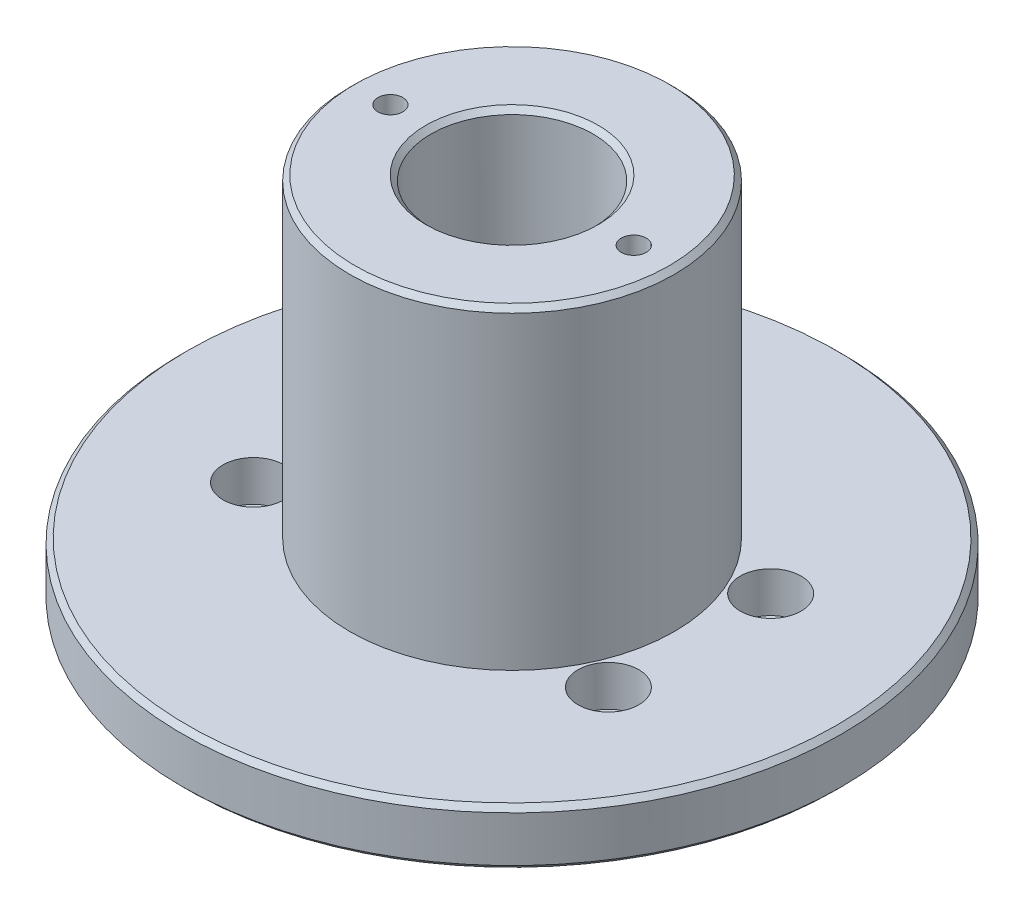
ISO-10303-21;
HEADER;
FILE_DESCRIPTION(('STEP AP214'),'2;1');
FILE_NAME('part.step','',(''),(''),'','','');
FILE_SCHEMA(('AUTOMOTIVE_DESIGN { 1 0 10303 214 1 1 1 1 }'));
ENDSEC;
DATA;
#1=APPLICATION_CONTEXT('core data for automotive mechanical design processes');
#2=APPLICATION_PROTOCOL_DEFINITION('international standard','automotive_design',2000,#1);
#3=PRODUCT_CONTEXT('',#1,'mechanical');
#4=PRODUCT('Part','Part','',(#3));
#5=PRODUCT_RELATED_PRODUCT_CATEGORY('part','',(#4));
#6=PRODUCT_DEFINITION_FORMATION('','',#4);
#7=PRODUCT_DEFINITION_CONTEXT('part definition',#1,'design');
#8=PRODUCT_DEFINITION('design','',#6,#7);
#9=PRODUCT_DEFINITION_SHAPE('','',#8);
#10=(LENGTH_UNIT() NAMED_UNIT(*) SI_UNIT(.MILLI.,.METRE.));
#11=(NAMED_UNIT(*) PLANE_ANGLE_UNIT() SI_UNIT($,.RADIAN.));
#12=(NAMED_UNIT(*) SI_UNIT($,.STERADIAN.) SOLID_ANGLE_UNIT());
#13=UNCERTAINTY_MEASURE_WITH_UNIT(LENGTH_MEASURE(1.E-05),#10,'distance_accuracy_value','');
#14=(GEOMETRIC_REPRESENTATION_CONTEXT(3) GLOBAL_UNCERTAINTY_ASSIGNED_CONTEXT((#13)) GLOBAL_UNIT_ASSIGNED_CONTEXT((#10,
#11,#12)) REPRESENTATION_CONTEXT('',''));
#15=CARTESIAN_POINT('',(0.,0.,0.));
#16=DIRECTION('',(0.,0.,1.));
#17=DIRECTION('',(1.,0.,0.));
#18=AXIS2_PLACEMENT_3D('',#15,#16,#17);
#19=CARTESIAN_POINT('',(-44.3647992402862,5.4957909129693,25.1937929558718));
#20=DIRECTION('',(0.,-1.,0.));
#21=DIRECTION('',(1.,0.,0.));
#22=AXIS2_PLACEMENT_3D('',#19,#20,#21);
#23=PLANE('',#22);
#24=CARTESIAN_POINT('',(-44.3647992402862,5.4957909129693,25.1937929558718));
#25=DIRECTION('',(0.,1.,0.));
#26=DIRECTION('',(-1.,0.,0.));
#27=AXIS2_PLACEMENT_3D('',#24,#25,#26);
#28=CIRCLE('',#27,8.);
#29=CARTESIAN_POINT('',(-52.3647992402862,5.4957909129693,25.1937929558718));
#30=VERTEX_POINT('',#29);
#31=EDGE_CURVE('E20',#30,#30,#28,.T.);
#32=ORIENTED_EDGE('',*,*,#31,.T.);
#33=EDGE_LOOP('',(#32));
#34=FACE_BOUND('',#33,.T.);
#35=ADVANCED_FACE('F17',(#34),#23,.F.);
#36=CARTESIAN_POINT('',(-32.3647992402862,26.495790912918,25.1937929558718));
#37=DIRECTION('',(0.,1.,0.));
#38=DIRECTION('',(-1.,0.,0.));
#39=AXIS2_PLACEMENT_3D('',#36,#37,#38);
#40=CONICAL_SURFACE('',#39,1.22949999989212,1.02974425857207);
#41=CARTESIAN_POINT('',(-32.364799240213,25.7570327818826,25.1937929558718));
#42=VERTEX_POINT('',#41);
#43=VERTEX_LOOP('',#42);
#44=FACE_BOUND('',#43,.T.);
#45=CARTESIAN_POINT('',(-32.3647992402862,26.4957909129693,25.1937929558718));
#46=DIRECTION('',(0.,1.,0.));
#47=DIRECTION('',(-1.,0.,0.));
#48=AXIS2_PLACEMENT_3D('',#45,#46,#47);
#49=CIRCLE('',#48,1.2295);
#50=CARTESIAN_POINT('',(-33.5942992402862,26.4957909129693,25.1937929558718));
#51=VERTEX_POINT('',#50);
#52=EDGE_CURVE('E45',#51,#51,#49,.T.);
#53=ORIENTED_EDGE('',*,*,#52,.T.);
#54=EDGE_LOOP('',(#53));
#55=FACE_BOUND('',#54,.T.);
#56=ADVANCED_FACE('F39',(#44,#55),#40,.F.);
#57=CARTESIAN_POINT('',(-56.3647992402862,26.495790912918,25.1937929558718));
#58=DIRECTION('',(0.,1.,0.));
#59=DIRECTION('',(0.,0.,1.));
#60=AXIS2_PLACEMENT_3D('',#57,#58,#59);
#61=CONICAL_SURFACE('',#60,1.22949999989302,1.02974425851834);
#62=CARTESIAN_POINT('',(-56.364799240157,25.7570327818257,25.1937929558718));
#63=VERTEX_POINT('',#62);
#64=VERTEX_LOOP('',#63);
#65=FACE_BOUND('',#64,.T.);
#66=CARTESIAN_POINT('',(-56.3647992402862,26.4957909129693,25.1937929558718));
#67=DIRECTION('',(0.,1.,0.));
#68=DIRECTION('',(-1.,0.,0.));
#69=AXIS2_PLACEMENT_3D('',#66,#67,#68);
#70=CIRCLE('',#69,1.2295);
#71=CARTESIAN_POINT('',(-57.5942992402862,26.4957909129693,25.1937929558718));
#72=VERTEX_POINT('',#71);
#73=EDGE_CURVE('E47',#72,#72,#70,.T.);
#74=ORIENTED_EDGE('',*,*,#73,.T.);
#75=EDGE_LOOP('',(#74));
#76=FACE_BOUND('',#75,.T.);
#77=ADVANCED_FACE('F42',(#65,#76),#61,.F.);
#78=CARTESIAN_POINT('',(-44.3647992402862,5.4957909129693,25.1937929558718));
#79=DIRECTION('',(0.,1.,0.));
#80=DIRECTION('',(-1.,0.,0.));
#81=AXIS2_PLACEMENT_3D('',#78,#79,#80);
#82=CYLINDRICAL_SURFACE('',#81,8.);
#83=CARTESIAN_POINT('',(-44.3647992402862,35.9957909129699,25.1937929558718));
#84=DIRECTION('',(0.,1.,0.));
#85=DIRECTION('',(1.,0.,0.));
#86=AXIS2_PLACEMENT_3D('',#83,#84,#85);
#87=CIRCLE('',#86,7.99999999999936);
#88=CARTESIAN_POINT('',(-36.3647992402868,35.9957909129699,25.1937929558718));
#89=VERTEX_POINT('',#88);
#90=EDGE_CURVE('E50',#89,#89,#87,.T.);
#91=ORIENTED_EDGE('',*,*,#90,.T.);
#92=EDGE_LOOP('',(#91));
#93=FACE_BOUND('',#92,.T.);
#94=ORIENTED_EDGE('',*,*,#31,.F.);
#95=EDGE_LOOP('',(#94));
#96=FACE_BOUND('',#95,.T.);
#97=ADVANCED_FACE('F250',(#93,#96),#82,.F.);
#98=CARTESIAN_POINT('',(-32.3647992402862,31.4957909129693,25.1937929558718));
#99=DIRECTION('',(0.,1.,0.));
#100=DIRECTION('',(-1.,0.,0.));
#101=AXIS2_PLACEMENT_3D('',#98,#99,#100);
#102=CYLINDRICAL_SURFACE('',#101,1.2295);
#103=ORIENTED_EDGE('',*,*,#52,.F.);
#104=EDGE_LOOP('',(#103));
#105=FACE_BOUND('',#104,.T.);
#106=CARTESIAN_POINT('',(-32.3647992402862,36.4957909129693,25.1937929558718));
#107=DIRECTION('',(0.,1.,0.));
#108=DIRECTION('',(-1.,0.,0.));
#109=AXIS2_PLACEMENT_3D('',#106,#107,#108);
#110=CIRCLE('',#109,1.2295);
#111=CARTESIAN_POINT('',(-33.5942992402862,36.4957909129693,25.1937929558718));
#112=VERTEX_POINT('',#111);
#113=EDGE_CURVE('E141',#112,#112,#110,.T.);
#114=ORIENTED_EDGE('',*,*,#113,.T.);
#115=EDGE_LOOP('',(#114));
#116=FACE_BOUND('',#115,.T.);
#117=ADVANCED_FACE('F246',(#105,#116),#102,.F.);
#118=CARTESIAN_POINT('',(-56.3647992402862,31.4957909129693,25.1937929558718));
#119=DIRECTION('',(0.,1.,0.));
#120=DIRECTION('',(-1.,0.,0.));
#121=AXIS2_PLACEMENT_3D('',#118,#119,#120);
#122=CYLINDRICAL_SURFACE('',#121,1.2295);
#123=ORIENTED_EDGE('',*,*,#73,.F.);
#124=EDGE_LOOP('',(#123));
#125=FACE_BOUND('',#124,.T.);
#126=CARTESIAN_POINT('',(-56.3647992402862,36.4957909129693,25.1937929558718));
#127=DIRECTION('',(0.,1.,0.));
#128=DIRECTION('',(-1.,0.,0.));
#129=AXIS2_PLACEMENT_3D('',#126,#127,#128);
#130=CIRCLE('',#129,1.2295);
#131=CARTESIAN_POINT('',(-57.5942992402862,36.4957909129693,25.1937929558718));
#132=VERTEX_POINT('',#131);
#133=EDGE_CURVE('E139',#132,#132,#130,.T.);
#134=ORIENTED_EDGE('',*,*,#133,.T.);
#135=EDGE_LOOP('',(#134));
#136=FACE_BOUND('',#135,.T.);
#137=ADVANCED_FACE('F242',(#125,#136),#122,.F.);
#138=CARTESIAN_POINT('',(-44.3647992402862,36.4957909129687,25.1937929558718));
#139=DIRECTION('',(0.,1.,0.));
#140=DIRECTION('',(0.,0.,1.));
#141=AXIS2_PLACEMENT_3D('',#138,#139,#140);
#142=CONICAL_SURFACE('',#141,8.50000000000064,0.785398163400002);
#143=CARTESIAN_POINT('',(-44.3647992402862,36.4957909129687,25.1937929558718));
#144=DIRECTION('',(0.,1.,0.));
#145=DIRECTION('',(0.,0.,1.));
#146=AXIS2_PLACEMENT_3D('',#143,#144,#145);
#147=CIRCLE('',#146,8.50000000000064);
#148=CARTESIAN_POINT('',(-44.3647992402862,36.4957909129687,33.6937929558724));
#149=VERTEX_POINT('',#148);
#150=EDGE_CURVE('E136',#149,#149,#147,.T.);
#151=ORIENTED_EDGE('',*,*,#150,.T.);
#152=EDGE_LOOP('',(#151));
#153=FACE_BOUND('',#152,.T.);
#154=ORIENTED_EDGE('',*,*,#90,.F.);
#155=EDGE_LOOP('',(#154));
#156=FACE_BOUND('',#155,.T.);
#157=ADVANCED_FACE('F238',(#153,#156),#142,.F.);
#158=CARTESIAN_POINT('',(-44.3647992402862,36.4957909129693,25.1937929558718));
#159=DIRECTION('',(0.,-1.,0.));
#160=DIRECTION('',(1.,0.,0.));
#161=AXIS2_PLACEMENT_3D('',#158,#159,#160);
#162=PLANE('',#161);
#163=ORIENTED_EDGE('',*,*,#150,.F.);
#164=EDGE_LOOP('',(#163));
#165=FACE_BOUND('',#164,.T.);
#166=ORIENTED_EDGE('',*,*,#133,.F.);
#167=EDGE_LOOP('',(#166));
#168=FACE_BOUND('',#167,.T.);
#169=ORIENTED_EDGE('',*,*,#113,.F.);
#170=EDGE_LOOP('',(#169));
#171=FACE_BOUND('',#170,.T.);
#172=CARTESIAN_POINT('',(-44.3647992402862,36.4957909129687,25.1937929558718));
#173=DIRECTION('',(0.,-1.,0.));
#174=DIRECTION('',(1.,0.,0.));
#175=AXIS2_PLACEMENT_3D('',#172,#173,#174);
#176=CIRCLE('',#175,15.4999999999994);
#177=CARTESIAN_POINT('',(-28.8647992402869,36.4957909129687,25.1937929558718));
#178=VERTEX_POINT('',#177);
#179=EDGE_CURVE('E133',#178,#178,#176,.T.);
#180=ORIENTED_EDGE('',*,*,#179,.F.);
#181=EDGE_LOOP('',(#180));
#182=FACE_BOUND('',#181,.T.);
#183=ADVANCED_FACE('F234',(#165,#168,#171,#182),#162,.F.);
#184=CARTESIAN_POINT('',(-44.3647992402862,35.9957909129699,25.1937929558718));
#185=DIRECTION('',(0.,-1.,0.));
#186=DIRECTION('',(1.,0.,0.));
#187=AXIS2_PLACEMENT_3D('',#184,#185,#186);
#188=CONICAL_SURFACE('',#187,16.0000000000006,0.785398163400002);
#189=ORIENTED_EDGE('',*,*,#179,.T.);
#190=EDGE_LOOP('',(#189));
#191=FACE_BOUND('',#190,.T.);
#192=CARTESIAN_POINT('',(-44.3647992402862,35.9957909129693,25.1937929558718));
#193=DIRECTION('',(0.,1.,0.));
#194=DIRECTION('',(-1.,0.,0.));
#195=AXIS2_PLACEMENT_3D('',#192,#193,#194);
#196=CIRCLE('',#195,16.);
#197=CARTESIAN_POINT('',(-60.3647992402862,35.9957909129693,25.1937929558718));
#198=VERTEX_POINT('',#197);
#199=EDGE_CURVE('E132',#198,#198,#196,.F.);
#200=ORIENTED_EDGE('',*,*,#199,.F.);
#201=EDGE_LOOP('',(#200));
#202=FACE_BOUND('',#201,.T.);
#203=ADVANCED_FACE('F230',(#191,#202),#188,.T.);
#204=CARTESIAN_POINT('',(-44.3647992402862,5.4957909129693,25.1937929558718));
#205=DIRECTION('',(0.,1.,0.));
#206=DIRECTION('',(-1.,0.,0.));
#207=AXIS2_PLACEMENT_3D('',#204,#205,#206);
#208=CYLINDRICAL_SURFACE('',#207,16.);
#209=ORIENTED_EDGE('',*,*,#199,.T.);
#210=EDGE_LOOP('',(#209));
#211=FACE_BOUND('',#210,.T.);
#212=CARTESIAN_POINT('',(-44.3647992402862,5.4957909129693,25.1937929558718));
#213=DIRECTION('',(0.,1.,0.));
#214=DIRECTION('',(-1.,0.,0.));
#215=AXIS2_PLACEMENT_3D('',#212,#213,#214);
#216=CIRCLE('',#215,16.);
#217=CARTESIAN_POINT('',(-60.3647992402862,5.4957909129693,25.1937929558718));
#218=VERTEX_POINT('',#217);
#219=EDGE_CURVE('E129',#218,#218,#216,.T.);
#220=ORIENTED_EDGE('',*,*,#219,.T.);
#221=EDGE_LOOP('',(#220));
#222=FACE_BOUND('',#221,.T.);
#223=ADVANCED_FACE('F223',(#211,#222),#208,.T.);
#224=CARTESIAN_POINT('',(-44.3647992402862,5.4957909129693,25.1937929558718));
#225=DIRECTION('',(0.,-1.,0.));
#226=DIRECTION('',(1.,0.,0.));
#227=AXIS2_PLACEMENT_3D('',#224,#225,#226);
#228=PLANE('',#227);
#229=ORIENTED_EDGE('',*,*,#219,.F.);
#230=EDGE_LOOP('',(#229));
#231=FACE_BOUND('',#230,.T.);
#232=CARTESIAN_POINT('',(-26.8647992402862,5.4957909129693,33.1937929558718));
#233=DIRECTION('',(0.,1.,0.));
#234=DIRECTION('',(-1.,0.,0.));
#235=AXIS2_PLACEMENT_3D('',#232,#233,#234);
#236=CIRCLE('',#235,3.);
#237=CARTESIAN_POINT('',(-29.8647992402862,5.4957909129693,33.1937929558718));
#238=VERTEX_POINT('',#237);
#239=EDGE_CURVE('E123',#238,#238,#236,.F.);
#240=ORIENTED_EDGE('',*,*,#239,.T.);
#241=EDGE_LOOP('',(#240));
#242=FACE_BOUND('',#241,.T.);
#243=CARTESIAN_POINT('',(-61.8647992402862,5.4957909129693,33.1937929558718));
#244=DIRECTION('',(0.,1.,0.));
#245=DIRECTION('',(-1.,0.,0.));
#246=AXIS2_PLACEMENT_3D('',#243,#244,#245);
#247=CIRCLE('',#246,3.);
#248=CARTESIAN_POINT('',(-64.8647992402862,5.4957909129693,33.1937929558718));
#249=VERTEX_POINT('',#248);
#250=EDGE_CURVE('E120',#249,#249,#247,.F.);
#251=ORIENTED_EDGE('',*,*,#250,.T.);
#252=EDGE_LOOP('',(#251));
#253=FACE_BOUND('',#252,.T.);
#254=CARTESIAN_POINT('',(-26.8647992402862,5.4957909129693,17.1937929558718));
#255=DIRECTION('',(0.,1.,0.));
#256=DIRECTION('',(-1.,0.,0.));
#257=AXIS2_PLACEMENT_3D('',#254,#255,#256);
#258=CIRCLE('',#257,3.);
#259=CARTESIAN_POINT('',(-29.8647992402862,5.4957909129693,17.1937929558718));
#260=VERTEX_POINT('',#259);
#261=EDGE_CURVE('E117',#260,#260,#258,.F.);
#262=ORIENTED_EDGE('',*,*,#261,.T.);
#263=EDGE_LOOP('',(#262));
#264=FACE_BOUND('',#263,.T.);
#265=CARTESIAN_POINT('',(-61.8647992402862,5.4957909129693,17.1937929558718));
#266=DIRECTION('',(0.,1.,0.));
#267=DIRECTION('',(-1.,0.,0.));
#268=AXIS2_PLACEMENT_3D('',#265,#266,#267);
#269=CIRCLE('',#268,3.);
#270=CARTESIAN_POINT('',(-64.8647992402862,5.4957909129693,17.1937929558718));
#271=VERTEX_POINT('',#270);
#272=EDGE_CURVE('E114',#271,#271,#269,.F.);
#273=ORIENTED_EDGE('',*,*,#272,.T.);
#274=EDGE_LOOP('',(#273));
#275=FACE_BOUND('',#274,.T.);
#276=CARTESIAN_POINT('',(-44.3647992402862,5.49579091296866,25.1937929558718));
#277=DIRECTION('',(0.,-1.,0.));
#278=DIRECTION('',(1.,0.,0.));
#279=AXIS2_PLACEMENT_3D('',#276,#277,#278);
#280=CIRCLE('',#279,31.9999999999994);
#281=CARTESIAN_POINT('',(-12.3647992402868,5.49579091296866,25.1937929558718));
#282=VERTEX_POINT('',#281);
#283=EDGE_CURVE('E126',#282,#282,#280,.T.);
#284=ORIENTED_EDGE('',*,*,#283,.F.);
#285=EDGE_LOOP('',(#284));
#286=FACE_BOUND('',#285,.T.);
#287=ADVANCED_FACE('F212',(#231,#242,#253,#264,#275,#286),#228,.F.);
#288=CARTESIAN_POINT('',(-44.3647992402862,4.99579091296993,25.1937929558718));
#289=DIRECTION('',(0.,-1.,0.));
#290=DIRECTION('',(1.,0.,0.));
#291=AXIS2_PLACEMENT_3D('',#288,#289,#290);
#292=CONICAL_SURFACE('',#291,32.5000000000006,0.785398163399997);
#293=ORIENTED_EDGE('',*,*,#283,.T.);
#294=EDGE_LOOP('',(#293));
#295=FACE_BOUND('',#294,.T.);
#296=CARTESIAN_POINT('',(-44.3647992402862,4.9957909129693,25.1937929558718));
#297=DIRECTION('',(0.,-1.,0.));
#298=DIRECTION('',(1.,0.,0.));
#299=AXIS2_PLACEMENT_3D('',#296,#297,#298);
#300=CIRCLE('',#299,32.5);
#301=CARTESIAN_POINT('',(-11.8647992402862,4.9957909129693,25.1937929558718));
#302=VERTEX_POINT('',#301);
#303=EDGE_CURVE('E113',#302,#302,#300,.T.);
#304=ORIENTED_EDGE('',*,*,#303,.F.);
#305=EDGE_LOOP('',(#304));
#306=FACE_BOUND('',#305,.T.);
#307=ADVANCED_FACE('F209',(#295,#306),#292,.T.);
#308=CARTESIAN_POINT('',(-26.8647992402862,3.4957909129693,33.1937929558718));
#309=DIRECTION('',(0.,1.,0.));
#310=DIRECTION('',(-1.,0.,0.));
#311=AXIS2_PLACEMENT_3D('',#308,#309,#310);
#312=CYLINDRICAL_SURFACE('',#311,3.);
#313=CARTESIAN_POINT('',(-26.8647992402862,1.4957909129693,33.1937929558718));
#314=DIRECTION('',(0.,1.,0.));
#315=DIRECTION('',(-1.,0.,0.));
#316=AXIS2_PLACEMENT_3D('',#313,#314,#315);
#317=CIRCLE('',#316,3.);
#318=CARTESIAN_POINT('',(-29.8647992402862,1.4957909129693,33.1937929558718));
#319=VERTEX_POINT('',#318);
#320=EDGE_CURVE('E110',#319,#319,#317,.T.);
#321=ORIENTED_EDGE('',*,*,#320,.F.);
#322=EDGE_LOOP('',(#321));
#323=FACE_BOUND('',#322,.T.);
#324=ORIENTED_EDGE('',*,*,#239,.F.);
#325=EDGE_LOOP('',(#324));
#326=FACE_BOUND('',#325,.T.);
#327=ADVANCED_FACE('F211',(#323,#326),#312,.F.);
#328=CARTESIAN_POINT('',(-61.8647992402862,3.4957909129693,33.1937929558718));
#329=DIRECTION('',(0.,1.,0.));
#330=DIRECTION('',(-1.,0.,0.));
#331=AXIS2_PLACEMENT_3D('',#328,#329,#330);
#332=CYLINDRICAL_SURFACE('',#331,3.);
#333=CARTESIAN_POINT('',(-61.8647992402862,1.4957909129693,33.1937929558718));
#334=DIRECTION('',(0.,1.,0.));
#335=DIRECTION('',(-1.,0.,0.));
#336=AXIS2_PLACEMENT_3D('',#333,#334,#335);
#337=CIRCLE('',#336,3.);
#338=CARTESIAN_POINT('',(-64.8647992402862,1.4957909129693,33.1937929558718));
#339=VERTEX_POINT('',#338);
#340=EDGE_CURVE('E107',#339,#339,#337,.T.);
#341=ORIENTED_EDGE('',*,*,#340,.F.);
#342=EDGE_LOOP('',(#341));
#343=FACE_BOUND('',#342,.T.);
#344=ORIENTED_EDGE('',*,*,#250,.F.);
#345=EDGE_LOOP('',(#344));
#346=FACE_BOUND('',#345,.T.);
#347=ADVANCED_FACE('F220',(#343,#346),#332,.F.);
#348=CARTESIAN_POINT('',(-26.8647992402862,3.4957909129693,17.1937929558718));
#349=DIRECTION('',(0.,1.,0.));
#350=DIRECTION('',(-1.,0.,0.));
#351=AXIS2_PLACEMENT_3D('',#348,#349,#350);
#352=CYLINDRICAL_SURFACE('',#351,3.);
#353=CARTESIAN_POINT('',(-26.8647992402862,1.4957909129693,17.1937929558718));
#354=DIRECTION('',(0.,1.,0.));
#355=DIRECTION('',(-1.,0.,0.));
#356=AXIS2_PLACEMENT_3D('',#353,#354,#355);
#357=CIRCLE('',#356,3.);
#358=CARTESIAN_POINT('',(-29.8647992402862,1.4957909129693,17.1937929558718));
#359=VERTEX_POINT('',#358);
#360=EDGE_CURVE('E104',#359,#359,#357,.T.);
#361=ORIENTED_EDGE('',*,*,#360,.F.);
#362=EDGE_LOOP('',(#361));
#363=FACE_BOUND('',#362,.T.);
#364=ORIENTED_EDGE('',*,*,#261,.F.);
#365=EDGE_LOOP('',(#364));
#366=FACE_BOUND('',#365,.T.);
#367=ADVANCED_FACE('F280',(#363,#366),#352,.F.);
#368=CARTESIAN_POINT('',(-61.8647992402862,3.4957909129693,17.1937929558718));
#369=DIRECTION('',(0.,1.,0.));
#370=DIRECTION('',(-1.,0.,0.));
#371=AXIS2_PLACEMENT_3D('',#368,#369,#370);
#372=CYLINDRICAL_SURFACE('',#371,3.);
#373=CARTESIAN_POINT('',(-61.8647992402862,1.4957909129693,17.1937929558718));
#374=DIRECTION('',(0.,1.,0.));
#375=DIRECTION('',(-1.,0.,0.));
#376=AXIS2_PLACEMENT_3D('',#373,#374,#375);
#377=CIRCLE('',#376,3.);
#378=CARTESIAN_POINT('',(-64.8647992402862,1.4957909129693,17.1937929558718));
#379=VERTEX_POINT('',#378);
#380=EDGE_CURVE('E100',#379,#379,#377,.T.);
#381=ORIENTED_EDGE('',*,*,#380,.F.);
#382=EDGE_LOOP('',(#381));
#383=FACE_BOUND('',#382,.T.);
#384=ORIENTED_EDGE('',*,*,#272,.F.);
#385=EDGE_LOOP('',(#384));
#386=FACE_BOUND('',#385,.T.);
#387=ADVANCED_FACE('F205',(#383,#386),#372,.F.);
#388=CARTESIAN_POINT('',(-44.3647992402862,2.7457909129693,25.1937929558718));
#389=DIRECTION('',(0.,-1.,0.));
#390=DIRECTION('',(1.,0.,0.));
#391=AXIS2_PLACEMENT_3D('',#388,#389,#390);
#392=CYLINDRICAL_SURFACE('',#391,32.5);
#393=CARTESIAN_POINT('',(-44.3647992402862,0.495790912968669,25.1937929558718));
#394=DIRECTION('',(0.,1.,0.));
#395=DIRECTION('',(-1.,0.,0.));
#396=AXIS2_PLACEMENT_3D('',#393,#394,#395);
#397=CIRCLE('',#396,32.5000000000006);
#398=CARTESIAN_POINT('',(-76.8647992402868,0.495790912968667,25.1937929558718));
#399=VERTEX_POINT('',#398);
#400=EDGE_CURVE('E103',#399,#399,#397,.F.);
#401=ORIENTED_EDGE('',*,*,#400,.F.);
#402=EDGE_LOOP('',(#401));
#403=FACE_BOUND('',#402,.T.);
#404=ORIENTED_EDGE('',*,*,#303,.T.);
#405=EDGE_LOOP('',(#404));
#406=FACE_BOUND('',#405,.T.);
#407=ADVANCED_FACE('F201',(#403,#406),#392,.T.);
#408=CARTESIAN_POINT('',(-44.3647992402862,2.4957909130876,33.1937929558718));
#409=DIRECTION('',(0.,-1.,0.));
#410=DIRECTION('',(0.,0.,-1.));
#411=AXIS2_PLACEMENT_3D('',#408,#409,#410);
#412=CONICAL_SURFACE('',#411,0.999999999821768,1.02974425846683);
#413=CARTESIAN_POINT('',(-44.3647992403839,3.09665153201877,33.1937929558718));
#414=VERTEX_POINT('',#413);
#415=VERTEX_LOOP('',#414);
#416=FACE_BOUND('',#415,.T.);
#417=CARTESIAN_POINT('',(-44.3647992402862,2.4957909129693,33.1937929558718));
#418=DIRECTION('',(0.,-1.,0.));
#419=DIRECTION('',(1.,0.,0.));
#420=AXIS2_PLACEMENT_3D('',#417,#418,#419);
#421=CIRCLE('',#420,1.);
#422=CARTESIAN_POINT('',(-43.3647992402862,2.4957909129693,33.1937929558718));
#423=VERTEX_POINT('',#422);
#424=EDGE_CURVE('E164',#423,#423,#421,.T.);
#425=ORIENTED_EDGE('',*,*,#424,.T.);
#426=EDGE_LOOP('',(#425));
#427=FACE_BOUND('',#426,.T.);
#428=ADVANCED_FACE('F204',(#416,#427),#412,.F.);
#429=CARTESIAN_POINT('',(-44.3647992402862,2.4957909130876,17.1937929558718));
#430=DIRECTION('',(0.,-1.,0.));
#431=DIRECTION('',(0.,0.,-1.));
#432=AXIS2_PLACEMENT_3D('',#429,#430,#431);
#433=CONICAL_SURFACE('',#432,0.999999999821768,1.02974425846683);
#434=CARTESIAN_POINT('',(-44.3647992403839,3.09665153201877,17.1937929558718));
#435=VERTEX_POINT('',#434);
#436=VERTEX_LOOP('',#435);
#437=FACE_BOUND('',#436,.T.);
#438=CARTESIAN_POINT('',(-44.3647992402862,2.4957909129693,17.1937929558718));
#439=DIRECTION('',(0.,1.,0.));
#440=DIRECTION('',(-1.,0.,0.));
#441=AXIS2_PLACEMENT_3D('',#438,#439,#440);
#442=CIRCLE('',#441,1.);
#443=CARTESIAN_POINT('',(-45.3647992402862,2.4957909129693,17.1937929558718));
#444=VERTEX_POINT('',#443);
#445=EDGE_CURVE('E99',#444,#444,#442,.F.);
#446=ORIENTED_EDGE('',*,*,#445,.T.);
#447=EDGE_LOOP('',(#446));
#448=FACE_BOUND('',#447,.T.);
#449=ADVANCED_FACE('F174',(#437,#448),#433,.F.);
#450=CARTESIAN_POINT('',(-26.8647992402862,1.4957909129693,33.1937929558718));
#451=DIRECTION('',(0.,1.,0.));
#452=DIRECTION('',(-1.,0.,0.));
#453=AXIS2_PLACEMENT_3D('',#450,#451,#452);
#454=PLANE('',#453);
#455=CARTESIAN_POINT('',(-26.8647992402862,1.49579091296929,33.1937929558718));
#456=DIRECTION('',(0.,1.,0.));
#457=DIRECTION('',(-1.,0.,0.));
#458=AXIS2_PLACEMENT_3D('',#455,#456,#457);
#459=CIRCLE('',#458,1.7);
#460=CARTESIAN_POINT('',(-28.5647992402862,1.49579091296929,33.1937929558718));
#461=VERTEX_POINT('',#460);
#462=EDGE_CURVE('E96',#461,#461,#459,.F.);
#463=ORIENTED_EDGE('',*,*,#462,.T.);
#464=EDGE_LOOP('',(#463));
#465=FACE_BOUND('',#464,.T.);
#466=ORIENTED_EDGE('',*,*,#320,.T.);
#467=EDGE_LOOP('',(#466));
#468=FACE_BOUND('',#467,.T.);
#469=ADVANCED_FACE('F300',(#465,#468),#454,.T.);
#470=CARTESIAN_POINT('',(-61.8647992402862,1.4957909129693,33.1937929558718));
#471=DIRECTION('',(0.,1.,0.));
#472=DIRECTION('',(-1.,0.,0.));
#473=AXIS2_PLACEMENT_3D('',#470,#471,#472);
#474=PLANE('',#473);
#475=CARTESIAN_POINT('',(-61.8647992402862,1.49579091296929,33.1937929558718));
#476=DIRECTION('',(0.,1.,0.));
#477=DIRECTION('',(-1.,0.,0.));
#478=AXIS2_PLACEMENT_3D('',#475,#476,#477);
#479=CIRCLE('',#478,1.7);
#480=CARTESIAN_POINT('',(-63.5647992402862,1.49579091296929,33.1937929558718));
#481=VERTEX_POINT('',#480);
#482=EDGE_CURVE('E93',#481,#481,#479,.F.);
#483=ORIENTED_EDGE('',*,*,#482,.T.);
#484=EDGE_LOOP('',(#483));
#485=FACE_BOUND('',#484,.T.);
#486=ORIENTED_EDGE('',*,*,#340,.T.);
#487=EDGE_LOOP('',(#486));
#488=FACE_BOUND('',#487,.T.);
#489=ADVANCED_FACE('F297',(#485,#488),#474,.T.);
#490=CARTESIAN_POINT('',(-26.8647992402862,1.4957909129693,17.1937929558718));
#491=DIRECTION('',(0.,1.,0.));
#492=DIRECTION('',(-1.,0.,0.));
#493=AXIS2_PLACEMENT_3D('',#490,#491,#492);
#494=PLANE('',#493);
#495=CARTESIAN_POINT('',(-26.8647992402862,1.49579091296929,17.1937929558718));
#496=DIRECTION('',(0.,1.,0.));
#497=DIRECTION('',(-1.,0.,0.));
#498=AXIS2_PLACEMENT_3D('',#495,#496,#497);
#499=CIRCLE('',#498,1.7);
#500=CARTESIAN_POINT('',(-28.5647992402862,1.49579091296929,17.1937929558718));
#501=VERTEX_POINT('',#500);
#502=EDGE_CURVE('E90',#501,#501,#499,.F.);
#503=ORIENTED_EDGE('',*,*,#502,.T.);
#504=EDGE_LOOP('',(#503));
#505=FACE_BOUND('',#504,.T.);
#506=ORIENTED_EDGE('',*,*,#360,.T.);
#507=EDGE_LOOP('',(#506));
#508=FACE_BOUND('',#507,.T.);
#509=ADVANCED_FACE('F299',(#505,#508),#494,.T.);
#510=CARTESIAN_POINT('',(-61.8647992402862,1.4957909129693,17.1937929558718));
#511=DIRECTION('',(0.,1.,0.));
#512=DIRECTION('',(-1.,0.,0.));
#513=AXIS2_PLACEMENT_3D('',#510,#511,#512);
#514=PLANE('',#513);
#515=CARTESIAN_POINT('',(-61.8647992402862,1.49579091296929,17.1937929558718));
#516=DIRECTION('',(0.,1.,0.));
#517=DIRECTION('',(-1.,0.,0.));
#518=AXIS2_PLACEMENT_3D('',#515,#516,#517);
#519=CIRCLE('',#518,1.7);
#520=CARTESIAN_POINT('',(-63.5647992402862,1.49579091296929,17.1937929558718));
#521=VERTEX_POINT('',#520);
#522=EDGE_CURVE('E87',#521,#521,#519,.F.);
#523=ORIENTED_EDGE('',*,*,#522,.T.);
#524=EDGE_LOOP('',(#523));
#525=FACE_BOUND('',#524,.T.);
#526=ORIENTED_EDGE('',*,*,#380,.T.);
#527=EDGE_LOOP('',(#526));
#528=FACE_BOUND('',#527,.T.);
#529=ADVANCED_FACE('F307',(#525,#528),#514,.T.);
#530=CARTESIAN_POINT('',(-44.3647992402862,1.4957909129693,40.9437929558718));
#531=DIRECTION('',(0.,-1.,0.));
#532=DIRECTION('',(1.,0.,0.));
#533=AXIS2_PLACEMENT_3D('',#530,#531,#532);
#534=PLANE('',#533);
#535=CARTESIAN_POINT('',(-44.3647992402862,1.49579091291803,40.9437929558718));
#536=DIRECTION('',(0.,1.,0.));
#537=DIRECTION('',(0.,0.,1.));
#538=AXIS2_PLACEMENT_3D('',#535,#536,#537);
#539=CIRCLE('',#538,2.49999999992494);
#540=CARTESIAN_POINT('',(-44.3647992402862,1.49579091291803,43.4437929557967));
#541=VERTEX_POINT('',#540);
#542=EDGE_CURVE('E84',#541,#541,#539,.F.);
#543=ORIENTED_EDGE('',*,*,#542,.T.);
#544=EDGE_LOOP('',(#543));
#545=FACE_BOUND('',#544,.T.);
#546=ADVANCED_FACE('F331',(#545),#534,.T.);
#547=CARTESIAN_POINT('',(-44.3647992402862,1.4957909129693,25.1937929558718));
#548=DIRECTION('',(0.,-1.,0.));
#549=DIRECTION('',(1.,0.,0.));
#550=AXIS2_PLACEMENT_3D('',#547,#548,#549);
#551=PLANE('',#550);
#552=CARTESIAN_POINT('',(-44.3647992402862,1.49579091291803,25.1937929558718));
#553=DIRECTION('',(0.,1.,0.));
#554=DIRECTION('',(0.,0.,1.));
#555=AXIS2_PLACEMENT_3D('',#552,#553,#554);
#556=CIRCLE('',#555,2.49999999992494);
#557=CARTESIAN_POINT('',(-44.3647992402862,1.49579091291803,27.6937929557967));
#558=VERTEX_POINT('',#557);
#559=EDGE_CURVE('E81',#558,#558,#556,.F.);
#560=ORIENTED_EDGE('',*,*,#559,.T.);
#561=EDGE_LOOP('',(#560));
#562=FACE_BOUND('',#561,.T.);
#563=ADVANCED_FACE('F197',(#562),#551,.T.);
#564=CARTESIAN_POINT('',(-44.3647992402862,0.49579091296866,25.1937929558718));
#565=DIRECTION('',(0.,1.,0.));
#566=DIRECTION('',(-1.,0.,0.));
#567=AXIS2_PLACEMENT_3D('',#564,#565,#566);
#568=CONICAL_SURFACE('',#567,32.5000000000006,0.785398163399999);
#569=CARTESIAN_POINT('',(-44.3647992402862,-0.00420908703006645,25.1937929558718));
#570=DIRECTION('',(0.,1.,0.));
#571=DIRECTION('',(-1.,0.,0.));
#572=AXIS2_PLACEMENT_3D('',#569,#570,#571);
#573=CIRCLE('',#572,31.9999999999994);
#574=CARTESIAN_POINT('',(-76.3647992402856,-0.00420908703006116,25.1937929558718));
#575=VERTEX_POINT('',#574);
#576=EDGE_CURVE('E78',#575,#575,#573,.F.);
#577=ORIENTED_EDGE('',*,*,#576,.F.);
#578=EDGE_LOOP('',(#577));
#579=FACE_BOUND('',#578,.T.);
#580=ORIENTED_EDGE('',*,*,#400,.T.);
#581=EDGE_LOOP('',(#580));
#582=FACE_BOUND('',#581,.T.);
#583=ADVANCED_FACE('F194',(#579,#582),#568,.T.);
#584=CARTESIAN_POINT('',(-44.3647992402862,1.2457909129693,33.1937929558718));
#585=DIRECTION('',(0.,-1.,0.));
#586=DIRECTION('',(1.,0.,0.));
#587=AXIS2_PLACEMENT_3D('',#584,#585,#586);
#588=CYLINDRICAL_SURFACE('',#587,1.);
#589=ORIENTED_EDGE('',*,*,#424,.F.);
#590=EDGE_LOOP('',(#589));
#591=FACE_BOUND('',#590,.T.);
#592=CARTESIAN_POINT('',(-44.3647992402862,-0.00420908703069995,33.1937929558718));
#593=DIRECTION('',(0.,-1.,0.));
#594=DIRECTION('',(1.,0.,0.));
#595=AXIS2_PLACEMENT_3D('',#592,#593,#594);
#596=CIRCLE('',#595,1.);
#597=CARTESIAN_POINT('',(-43.3647992402862,-0.00420908703070002,33.1937929558718));
#598=VERTEX_POINT('',#597);
#599=EDGE_CURVE('E75',#598,#598,#596,.F.);
#600=ORIENTED_EDGE('',*,*,#599,.F.);
#601=EDGE_LOOP('',(#600));
#602=FACE_BOUND('',#601,.T.);
#603=ADVANCED_FACE('F180',(#591,#602),#588,.F.);
#604=CARTESIAN_POINT('',(-44.3647992402862,1.2457909129693,17.1937929558718));
#605=DIRECTION('',(0.,1.,0.));
#606=DIRECTION('',(-1.,0.,0.));
#607=AXIS2_PLACEMENT_3D('',#604,#605,#606);
#608=CYLINDRICAL_SURFACE('',#607,1.);
#609=ORIENTED_EDGE('',*,*,#445,.F.);
#610=EDGE_LOOP('',(#609));
#611=FACE_BOUND('',#610,.T.);
#612=CARTESIAN_POINT('',(-44.3647992402862,-0.00420908703069995,17.1937929558718));
#613=DIRECTION('',(0.,1.,0.));
#614=DIRECTION('',(-1.,0.,0.));
#615=AXIS2_PLACEMENT_3D('',#612,#613,#614);
#616=CIRCLE('',#615,1.);
#617=CARTESIAN_POINT('',(-45.3647992402862,-0.00420908703069988,17.1937929558718));
#618=VERTEX_POINT('',#617);
#619=EDGE_CURVE('E72',#618,#618,#616,.T.);
#620=ORIENTED_EDGE('',*,*,#619,.F.);
#621=EDGE_LOOP('',(#620));
#622=FACE_BOUND('',#621,.T.);
#623=ADVANCED_FACE('F176',(#611,#622),#608,.F.);
#624=CARTESIAN_POINT('',(-26.8647992402862,-86.5924819560557,33.1937929558718));
#625=DIRECTION('',(0.,1.,0.));
#626=DIRECTION('',(-1.,0.,0.));
#627=AXIS2_PLACEMENT_3D('',#624,#625,#626);
#628=CYLINDRICAL_SURFACE('',#627,1.7);
#629=ORIENTED_EDGE('',*,*,#462,.F.);
#630=EDGE_LOOP('',(#629));
#631=FACE_BOUND('',#630,.T.);
#632=CARTESIAN_POINT('',(-26.8647992402862,-0.0042090870307071,33.1937929558718));
#633=DIRECTION('',(0.,1.,0.));
#634=DIRECTION('',(-1.,0.,0.));
#635=AXIS2_PLACEMENT_3D('',#632,#633,#634);
#636=CIRCLE('',#635,1.7);
#637=CARTESIAN_POINT('',(-28.5647992402862,-0.00420908703070698,33.1937929558718));
#638=VERTEX_POINT('',#637);
#639=EDGE_CURVE('E69',#638,#638,#636,.T.);
#640=ORIENTED_EDGE('',*,*,#639,.F.);
#641=EDGE_LOOP('',(#640));
#642=FACE_BOUND('',#641,.T.);
#643=ADVANCED_FACE('F179',(#631,#642),#628,.F.);
#644=CARTESIAN_POINT('',(-61.8647992402862,-86.5924819560557,33.1937929558718));
#645=DIRECTION('',(0.,1.,0.));
#646=DIRECTION('',(-1.,0.,0.));
#647=AXIS2_PLACEMENT_3D('',#644,#645,#646);
#648=CYLINDRICAL_SURFACE('',#647,1.7);
#649=ORIENTED_EDGE('',*,*,#482,.F.);
#650=EDGE_LOOP('',(#649));
#651=FACE_BOUND('',#650,.T.);
#652=CARTESIAN_POINT('',(-61.8647992402862,-0.00420908703069323,33.1937929558718));
#653=DIRECTION('',(0.,1.,0.));
#654=DIRECTION('',(-1.,0.,0.));
#655=AXIS2_PLACEMENT_3D('',#652,#653,#654);
#656=CIRCLE('',#655,1.7);
#657=CARTESIAN_POINT('',(-63.5647992402862,-0.00420908703069311,33.1937929558718));
#658=VERTEX_POINT('',#657);
#659=EDGE_CURVE('E66',#658,#658,#656,.T.);
#660=ORIENTED_EDGE('',*,*,#659,.F.);
#661=EDGE_LOOP('',(#660));
#662=FACE_BOUND('',#661,.T.);
#663=ADVANCED_FACE('F358',(#651,#662),#648,.F.);
#664=CARTESIAN_POINT('',(-26.8647992402862,-86.5924819560557,17.1937929558718));
#665=DIRECTION('',(0.,1.,0.));
#666=DIRECTION('',(-1.,0.,0.));
#667=AXIS2_PLACEMENT_3D('',#664,#665,#666);
#668=CYLINDRICAL_SURFACE('',#667,1.7);
#669=ORIENTED_EDGE('',*,*,#502,.F.);
#670=EDGE_LOOP('',(#669));
#671=FACE_BOUND('',#670,.T.);
#672=CARTESIAN_POINT('',(-26.8647992402862,-0.0042090870307071,17.1937929558718));
#673=DIRECTION('',(0.,1.,0.));
#674=DIRECTION('',(-1.,0.,0.));
#675=AXIS2_PLACEMENT_3D('',#672,#673,#674);
#676=CIRCLE('',#675,1.7);
#677=CARTESIAN_POINT('',(-28.5647992402862,-0.00420908703070698,17.1937929558718));
#678=VERTEX_POINT('',#677);
#679=EDGE_CURVE('E63',#678,#678,#676,.T.);
#680=ORIENTED_EDGE('',*,*,#679,.F.);
#681=EDGE_LOOP('',(#680));
#682=FACE_BOUND('',#681,.T.);
#683=ADVANCED_FACE('F346',(#671,#682),#668,.F.);
#684=CARTESIAN_POINT('',(-61.8647992402862,-86.5924819560557,17.1937929558718));
#685=DIRECTION('',(0.,1.,0.));
#686=DIRECTION('',(-1.,0.,0.));
#687=AXIS2_PLACEMENT_3D('',#684,#685,#686);
#688=CYLINDRICAL_SURFACE('',#687,1.7);
#689=ORIENTED_EDGE('',*,*,#522,.F.);
#690=EDGE_LOOP('',(#689));
#691=FACE_BOUND('',#690,.T.);
#692=CARTESIAN_POINT('',(-61.8647992402862,-0.00420908703069323,17.1937929558718));
#693=DIRECTION('',(0.,1.,0.));
#694=DIRECTION('',(-1.,0.,0.));
#695=AXIS2_PLACEMENT_3D('',#692,#693,#694);
#696=CIRCLE('',#695,1.7);
#697=CARTESIAN_POINT('',(-63.5647992402862,-0.00420908703069311,17.1937929558718));
#698=VERTEX_POINT('',#697);
#699=EDGE_CURVE('E60',#698,#698,#696,.T.);
#700=ORIENTED_EDGE('',*,*,#699,.F.);
#701=EDGE_LOOP('',(#700));
#702=FACE_BOUND('',#701,.T.);
#703=ADVANCED_FACE('F342',(#691,#702),#688,.F.);
#704=CARTESIAN_POINT('',(-44.3647992402862,1.49579091288388,40.9437929558718));
#705=DIRECTION('',(0.,1.,0.));
#706=DIRECTION('',(0.,0.,1.));
#707=AXIS2_PLACEMENT_3D('',#704,#705,#706);
#708=CONICAL_SURFACE('',#707,2.49999999986809,1.02974425867244);
#709=CARTESIAN_POINT('',(-44.3647992402862,-0.00420908702380984,40.9437929558718));
#710=DIRECTION('',(0.,1.,0.));
#711=DIRECTION('',(0.,0.,1.));
#712=AXIS2_PLACEMENT_3D('',#709,#710,#711);
#713=CIRCLE('',#712,0.00358077651978206);
#714=CARTESIAN_POINT('',(-44.3647992402862,-0.00420908702380984,40.9473737323916));
#715=VERTEX_POINT('',#714);
#716=EDGE_CURVE('E26',#715,#715,#713,.T.);
#717=CARTESIAN_POINT('',(-44.3647992402862,1.49579091291803,43.4437929557967));
#718=CARTESIAN_POINT('',(-44.3647992402862,1.48016591291864,43.4177885888863));
#719=CARTESIAN_POINT('',(-44.3647992402862,1.46454091291924,43.3917842219758));
#720=CARTESIAN_POINT('',(-44.3647992402862,1.43329091292045,43.3397754881549));
#721=CARTESIAN_POINT('',(-44.3647992402862,1.41766591292106,43.3137711212444));
#722=CARTESIAN_POINT('',(-44.3647992402862,1.38641591292227,43.2617623874234));
#723=CARTESIAN_POINT('',(-44.3647992402862,1.37079091292288,43.235758020513));
#724=CARTESIAN_POINT('',(-44.3647992402862,1.33954091292409,43.183749286692));
#725=CARTESIAN_POINT('',(-44.3647992402862,1.3239159129247,43.1577449197816));
#726=CARTESIAN_POINT('',(-44.3647992402862,1.29266591292591,43.1057361859606));
#727=CARTESIAN_POINT('',(-44.3647992402862,1.27704091292651,43.0797318190502));
#728=CARTESIAN_POINT('',(-44.3647992402862,1.24579091292772,43.0277230852292));
#729=CARTESIAN_POINT('',(-44.3647992402862,1.23016591292833,43.0017187183187));
#730=CARTESIAN_POINT('',(-44.3647992402862,1.19891591292954,42.9497099844978));
#731=CARTESIAN_POINT('',(-44.3647992402862,1.18329091293015,42.9237056175873));
#732=CARTESIAN_POINT('',(-44.3647992402862,1.15204091293136,42.8716968837664));
#733=CARTESIAN_POINT('',(-44.3647992402862,1.13641591293197,42.8456925168559));
#734=CARTESIAN_POINT('',(-44.3647992402862,1.10516591293318,42.793683783035));
#735=CARTESIAN_POINT('',(-44.3647992402862,1.08954091293378,42.7676794161245));
#736=CARTESIAN_POINT('',(-44.3647992402862,1.05829091293499,42.7156706823036));
#737=CARTESIAN_POINT('',(-44.3647992402862,1.0426659129356,42.6896663153931));
#738=CARTESIAN_POINT('',(-44.3647992402862,1.01141591293681,42.6376575815722));
#739=CARTESIAN_POINT('',(-44.3647992402862,0.995790912937418,42.6116532146617));
#740=CARTESIAN_POINT('',(-44.3647992402862,0.96454091293863,42.5596444808407));
#741=CARTESIAN_POINT('',(-44.3647992402862,0.948915912939235,42.5336401139303));
#742=CARTESIAN_POINT('',(-44.3647992402862,0.917665912940447,42.4816313801093));
#743=CARTESIAN_POINT('',(-44.3647992402862,0.902040912941053,42.4556270131989));
#744=CARTESIAN_POINT('',(-44.3647992402862,0.870790912942264,42.4036182793779));
#745=CARTESIAN_POINT('',(-44.3647992402862,0.85516591294287,42.3776139124675));
#746=CARTESIAN_POINT('',(-44.3647992402862,0.823915912944082,42.3256051786465));
#747=CARTESIAN_POINT('',(-44.3647992402862,0.808290912944688,42.299600811736));
#748=CARTESIAN_POINT('',(-44.3647992402862,0.777040912945899,42.2475920779151));
#749=CARTESIAN_POINT('',(-44.3647992402862,0.761415912946505,42.2215877110046));
#750=CARTESIAN_POINT('',(-44.3647992402862,0.730165912947717,42.1695789771837));
#751=CARTESIAN_POINT('',(-44.3647992402862,0.714540912948323,42.1435746102732));
#752=CARTESIAN_POINT('',(-44.3647992402862,0.683290912949534,42.0915658764523));
#753=CARTESIAN_POINT('',(-44.3647992402862,0.66766591295014,42.0655615095418));
#754=CARTESIAN_POINT('',(-44.3647992402862,0.636415912951352,42.0135527757209));
#755=CARTESIAN_POINT('',(-44.3647992402862,0.620790912951957,41.9875484088104));
#756=CARTESIAN_POINT('',(-44.3647992402862,0.589540912953169,41.9355396749895));
#757=CARTESIAN_POINT('',(-44.3647992402862,0.573915912953775,41.909535308079));
#758=CARTESIAN_POINT('',(-44.3647992402862,0.542665912954987,41.857526574258));
#759=CARTESIAN_POINT('',(-44.3647992402862,0.527040912955592,41.8315222073476));
#760=CARTESIAN_POINT('',(-44.3647992402862,0.495790912956804,41.7795134735266));
#761=CARTESIAN_POINT('',(-44.3647992402862,0.48016591295741,41.7535091066162));
#762=CARTESIAN_POINT('',(-44.3647992402862,0.448915912958621,41.7015003727952));
#763=CARTESIAN_POINT('',(-44.3647992402862,0.433290912959227,41.6754960058848));
#764=CARTESIAN_POINT('',(-44.3647992402862,0.402040912960439,41.6234872720638));
#765=CARTESIAN_POINT('',(-44.3647992402862,0.386415912961045,41.5974829051533));
#766=CARTESIAN_POINT('',(-44.3647992402862,0.355165912962256,41.5454741713324));
#767=CARTESIAN_POINT('',(-44.3647992402862,0.339540912962862,41.5194698044219));
#768=CARTESIAN_POINT('',(-44.3647992402862,0.308290912964074,41.467461070601));
#769=CARTESIAN_POINT('',(-44.3647992402862,0.29266591296468,41.4414567036905));
#770=CARTESIAN_POINT('',(-44.3647992402862,0.261415912965891,41.3894479698696));
#771=CARTESIAN_POINT('',(-44.3647992402862,0.245790912966497,41.3634436029591));
#772=CARTESIAN_POINT('',(-44.3647992402862,0.214540912967709,41.3114348691382));
#773=CARTESIAN_POINT('',(-44.3647992402862,0.198915912968314,41.2854305022277));
#774=CARTESIAN_POINT('',(-44.3647992402862,0.167665912969526,41.2334217684068));
#775=CARTESIAN_POINT('',(-44.3647992402862,0.152040912970132,41.2074174014963));
#776=CARTESIAN_POINT('',(-44.3647992402862,0.120790912971344,41.1554086676753));
#777=CARTESIAN_POINT('',(-44.3647992402862,0.105165912971949,41.1294043007649));
#778=CARTESIAN_POINT('',(-44.3647992402862,0.0739159129731609,41.0773955669439));
#779=CARTESIAN_POINT('',(-44.3647992402862,0.0582909129737668,41.0513912000335));
#780=CARTESIAN_POINT('',(-44.3647992402862,0.0270409129749785,40.9993824662125));
#781=CARTESIAN_POINT('',(-44.3647992402862,0.0114159129755844,40.9733780993021));
#782=CARTESIAN_POINT('',(-44.3647992402862,-0.00420908702380984,40.9473737323916));
#783=B_SPLINE_CURVE_WITH_KNOTS('',3,(#717,#718,#719,#720,#721,#722,#723,#724,#725,#726,#727,
#728,#729,#730,#731,#732,#733,#734,#735,#736,#737,#738,#739,#740,#741,#742,#743,#744,#745,#746,
#747,#748,#749,#750,#751,#752,#753,#754,#755,#756,#757,#758,#759,#760,#761,#762,#763,#764,#765,
#766,#767,#768,#769,#770,#771,#772,#773,#774,#775,#776,#777,#778,#779,#780,#781,#782),
.UNSPECIFIED.,.F.,.F.,(4,2,2,2,2,2,2,2,2,2,2,2,2,2,2,2,2,2,2,2,2,2,2,2,2,2,2,2,2,2,2,2,4),(0.,
0.0910126887338182,0.182025377467637,0.273038066201455,0.364050754935273,0.455063443669092,
0.54607613240291,0.637088821136728,0.728101509870547,0.819114198604365,0.910126887338184,
1.001139576072,1.09215226480582,1.18316495353964,1.27417764227346,1.36519033100728,
1.45620301974109,1.54721570847491,1.63822839720873,1.72924108594255,1.82025377467637,
1.91126646341019,2.002279152144,2.09329184087782,2.18430452961164,2.27531721834546,
2.36632990707928,2.4573425958131,2.54835528454691,2.63936797328073,2.73038066201455,
2.82139335074837,2.91240603948219),.UNSPECIFIED.);
#784=EDGE_CURVE('BSEAM345',#541,#715,#783,.T.);
#785=ORIENTED_EDGE('',*,*,#542,.F.);
#786=ORIENTED_EDGE('',*,*,#716,.F.);
#787=ORIENTED_EDGE('',*,*,#784,.T.);
#788=ORIENTED_EDGE('',*,*,#784,.F.);
#789=EDGE_LOOP('',(#785,#787,#786,#788));
#790=FACE_BOUND('',#789,.T.);
#791=ADVANCED_FACE('F345',(#790),#708,.F.);
#792=CARTESIAN_POINT('',(-44.3647992402862,1.49579091288388,25.1937929558718));
#793=DIRECTION('',(0.,1.,0.));
#794=DIRECTION('',(0.,0.,1.));
#795=AXIS2_PLACEMENT_3D('',#792,#793,#794);
#796=CONICAL_SURFACE('',#795,2.49999999986809,1.02974425867244);
#797=CARTESIAN_POINT('',(-44.3647992402862,-0.00420908702380984,25.1937929558718));
#798=DIRECTION('',(0.,1.,0.));
#799=DIRECTION('',(0.,0.,1.));
#800=AXIS2_PLACEMENT_3D('',#797,#798,#799);
#801=CIRCLE('',#800,0.00358077651978206);
#802=CARTESIAN_POINT('',(-44.3647992402862,-0.00420908702380984,25.1973737323916));
#803=VERTEX_POINT('',#802);
#804=EDGE_CURVE('E11',#803,#803,#801,.T.);
#805=CARTESIAN_POINT('',(-44.3647992402862,1.49579091291803,27.6937929557967));
#806=CARTESIAN_POINT('',(-44.3647992402862,1.48016591291864,27.6677885888863));
#807=CARTESIAN_POINT('',(-44.3647992402862,1.46454091291924,27.6417842219758));
#808=CARTESIAN_POINT('',(-44.3647992402862,1.43329091292045,27.5897754881549));
#809=CARTESIAN_POINT('',(-44.3647992402862,1.41766591292106,27.5637711212444));
#810=CARTESIAN_POINT('',(-44.3647992402862,1.38641591292227,27.5117623874234));
#811=CARTESIAN_POINT('',(-44.3647992402862,1.37079091292288,27.485758020513));
#812=CARTESIAN_POINT('',(-44.3647992402862,1.33954091292409,27.433749286692));
#813=CARTESIAN_POINT('',(-44.3647992402862,1.3239159129247,27.4077449197816));
#814=CARTESIAN_POINT('',(-44.3647992402862,1.29266591292591,27.3557361859606));
#815=CARTESIAN_POINT('',(-44.3647992402862,1.27704091292651,27.3297318190502));
#816=CARTESIAN_POINT('',(-44.3647992402862,1.24579091292772,27.2777230852292));
#817=CARTESIAN_POINT('',(-44.3647992402862,1.23016591292833,27.2517187183187));
#818=CARTESIAN_POINT('',(-44.3647992402862,1.19891591292954,27.1997099844978));
#819=CARTESIAN_POINT('',(-44.3647992402862,1.18329091293015,27.1737056175873));
#820=CARTESIAN_POINT('',(-44.3647992402862,1.15204091293136,27.1216968837664));
#821=CARTESIAN_POINT('',(-44.3647992402862,1.13641591293197,27.0956925168559));
#822=CARTESIAN_POINT('',(-44.3647992402862,1.10516591293318,27.043683783035));
#823=CARTESIAN_POINT('',(-44.3647992402862,1.08954091293378,27.0176794161245));
#824=CARTESIAN_POINT('',(-44.3647992402862,1.05829091293499,26.9656706823036));
#825=CARTESIAN_POINT('',(-44.3647992402862,1.0426659129356,26.9396663153931));
#826=CARTESIAN_POINT('',(-44.3647992402862,1.01141591293681,26.8876575815722));
#827=CARTESIAN_POINT('',(-44.3647992402862,0.995790912937418,26.8616532146617));
#828=CARTESIAN_POINT('',(-44.3647992402862,0.96454091293863,26.8096444808407));
#829=CARTESIAN_POINT('',(-44.3647992402862,0.948915912939235,26.7836401139303));
#830=CARTESIAN_POINT('',(-44.3647992402862,0.917665912940447,26.7316313801093));
#831=CARTESIAN_POINT('',(-44.3647992402862,0.902040912941053,26.7056270131989));
#832=CARTESIAN_POINT('',(-44.3647992402862,0.870790912942264,26.6536182793779));
#833=CARTESIAN_POINT('',(-44.3647992402862,0.85516591294287,26.6276139124675));
#834=CARTESIAN_POINT('',(-44.3647992402862,0.823915912944082,26.5756051786465));
#835=CARTESIAN_POINT('',(-44.3647992402862,0.808290912944688,26.549600811736));
#836=CARTESIAN_POINT('',(-44.3647992402862,0.777040912945899,26.4975920779151));
#837=CARTESIAN_POINT('',(-44.3647992402862,0.761415912946505,26.4715877110046));
#838=CARTESIAN_POINT('',(-44.3647992402862,0.730165912947717,26.4195789771837));
#839=CARTESIAN_POINT('',(-44.3647992402862,0.714540912948323,26.3935746102732));
#840=CARTESIAN_POINT('',(-44.3647992402862,0.683290912949534,26.3415658764523));
#841=CARTESIAN_POINT('',(-44.3647992402862,0.66766591295014,26.3155615095418));
#842=CARTESIAN_POINT('',(-44.3647992402862,0.636415912951352,26.2635527757209));
#843=CARTESIAN_POINT('',(-44.3647992402862,0.620790912951957,26.2375484088104));
#844=CARTESIAN_POINT('',(-44.3647992402862,0.589540912953169,26.1855396749895));
#845=CARTESIAN_POINT('',(-44.3647992402862,0.573915912953775,26.159535308079));
#846=CARTESIAN_POINT('',(-44.3647992402862,0.542665912954987,26.107526574258));
#847=CARTESIAN_POINT('',(-44.3647992402862,0.527040912955592,26.0815222073476));
#848=CARTESIAN_POINT('',(-44.3647992402862,0.495790912956804,26.0295134735266));
#849=CARTESIAN_POINT('',(-44.3647992402862,0.48016591295741,26.0035091066162));
#850=CARTESIAN_POINT('',(-44.3647992402862,0.448915912958621,25.9515003727952));
#851=CARTESIAN_POINT('',(-44.3647992402862,0.433290912959227,25.9254960058848));
#852=CARTESIAN_POINT('',(-44.3647992402862,0.402040912960439,25.8734872720638));
#853=CARTESIAN_POINT('',(-44.3647992402862,0.386415912961045,25.8474829051533));
#854=CARTESIAN_POINT('',(-44.3647992402862,0.355165912962256,25.7954741713324));
#855=CARTESIAN_POINT('',(-44.3647992402862,0.339540912962862,25.7694698044219));
#856=CARTESIAN_POINT('',(-44.3647992402862,0.308290912964074,25.717461070601));
#857=CARTESIAN_POINT('',(-44.3647992402862,0.29266591296468,25.6914567036905));
#858=CARTESIAN_POINT('',(-44.3647992402862,0.261415912965891,25.6394479698696));
#859=CARTESIAN_POINT('',(-44.3647992402862,0.245790912966497,25.6134436029591));
#860=CARTESIAN_POINT('',(-44.3647992402862,0.214540912967709,25.5614348691382));
#861=CARTESIAN_POINT('',(-44.3647992402862,0.198915912968314,25.5354305022277));
#862=CARTESIAN_POINT('',(-44.3647992402862,0.167665912969526,25.4834217684068));
#863=CARTESIAN_POINT('',(-44.3647992402862,0.152040912970132,25.4574174014963));
#864=CARTESIAN_POINT('',(-44.3647992402862,0.120790912971344,25.4054086676753));
#865=CARTESIAN_POINT('',(-44.3647992402862,0.105165912971949,25.3794043007649));
#866=CARTESIAN_POINT('',(-44.3647992402862,0.0739159129731609,25.3273955669439));
#867=CARTESIAN_POINT('',(-44.3647992402862,0.0582909129737668,25.3013912000335));
#868=CARTESIAN_POINT('',(-44.3647992402862,0.0270409129749785,25.2493824662125));
#869=CARTESIAN_POINT('',(-44.3647992402862,0.0114159129755844,25.2233780993021));
#870=CARTESIAN_POINT('',(-44.3647992402862,-0.00420908702380984,25.1973737323916));
#871=B_SPLINE_CURVE_WITH_KNOTS('',3,(#805,#806,#807,#808,#809,#810,#811,#812,#813,#814,#815,
#816,#817,#818,#819,#820,#821,#822,#823,#824,#825,#826,#827,#828,#829,#830,#831,#832,#833,#834,
#835,#836,#837,#838,#839,#840,#841,#842,#843,#844,#845,#846,#847,#848,#849,#850,#851,#852,#853,
#854,#855,#856,#857,#858,#859,#860,#861,#862,#863,#864,#865,#866,#867,#868,#869,#870),
.UNSPECIFIED.,.F.,.F.,(4,2,2,2,2,2,2,2,2,2,2,2,2,2,2,2,2,2,2,2,2,2,2,2,2,2,2,2,2,2,2,2,4),(0.,
0.0910126887338182,0.182025377467637,0.273038066201455,0.364050754935273,0.455063443669092,
0.54607613240291,0.637088821136728,0.728101509870547,0.819114198604365,0.910126887338184,
1.001139576072,1.09215226480582,1.18316495353964,1.27417764227346,1.36519033100728,
1.45620301974109,1.54721570847491,1.63822839720873,1.72924108594255,1.82025377467637,
1.91126646341019,2.002279152144,2.09329184087782,2.18430452961164,2.27531721834546,
2.36632990707928,2.4573425958131,2.54835528454691,2.63936797328073,2.73038066201455,
2.82139335074837,2.91240603948219),.UNSPECIFIED.);
#872=EDGE_CURVE('BSEAM187',#558,#803,#871,.T.);
#873=ORIENTED_EDGE('',*,*,#559,.F.);
#874=ORIENTED_EDGE('',*,*,#804,.F.);
#875=ORIENTED_EDGE('',*,*,#872,.T.);
#876=ORIENTED_EDGE('',*,*,#872,.F.);
#877=EDGE_LOOP('',(#873,#875,#874,#876));
#878=FACE_BOUND('',#877,.T.);
#879=ADVANCED_FACE('F187',(#878),#796,.F.);
#880=CARTESIAN_POINT('',(-44.3647992402862,-0.00420908703069989,25.1937929558718));
#881=DIRECTION('',(0.,-1.,0.));
#882=DIRECTION('',(1.,0.,0.));
#883=AXIS2_PLACEMENT_3D('',#880,#881,#882);
#884=PLANE('',#883);
#885=ORIENTED_EDGE('',*,*,#804,.T.);
#886=EDGE_LOOP('',(#885));
#887=FACE_BOUND('',#886,.T.);
#888=ORIENTED_EDGE('',*,*,#716,.T.);
#889=EDGE_LOOP('',(#888));
#890=FACE_BOUND('',#889,.T.);
#891=ORIENTED_EDGE('',*,*,#699,.T.);
#892=EDGE_LOOP('',(#891));
#893=FACE_BOUND('',#892,.T.);
#894=ORIENTED_EDGE('',*,*,#679,.T.);
#895=EDGE_LOOP('',(#894));
#896=FACE_BOUND('',#895,.T.);
#897=ORIENTED_EDGE('',*,*,#659,.T.);
#898=EDGE_LOOP('',(#897));
#899=FACE_BOUND('',#898,.T.);
#900=ORIENTED_EDGE('',*,*,#639,.T.);
#901=EDGE_LOOP('',(#900));
#902=FACE_BOUND('',#901,.T.);
#903=ORIENTED_EDGE('',*,*,#619,.T.);
#904=EDGE_LOOP('',(#903));
#905=FACE_BOUND('',#904,.T.);
#906=ORIENTED_EDGE('',*,*,#599,.T.);
#907=EDGE_LOOP('',(#906));
#908=FACE_BOUND('',#907,.T.);
#909=ORIENTED_EDGE('',*,*,#576,.T.);
#910=EDGE_LOOP('',(#909));
#911=FACE_BOUND('',#910,.T.);
#912=ADVANCED_FACE('F184',(#887,#890,#893,#896,#899,#902,#905,#908,#911),#884,.T.);
#913=CLOSED_SHELL('',(#35,#56,#77,#97,#117,#137,#157,#183,#203,#223,#287,#307,#327,#347,#367,
#387,#407,#428,#449,#469,#489,#509,#529,#546,#563,#583,#603,#623,#643,#663,#683,#703,#791,#879,#912));
#914=MANIFOLD_SOLID_BREP('B1',#913);
#915=ADVANCED_BREP_SHAPE_REPRESENTATION('',(#18,#914),#14);
#916=SHAPE_DEFINITION_REPRESENTATION(#9,#915);
ENDSEC;
END-ISO-10303-21;
